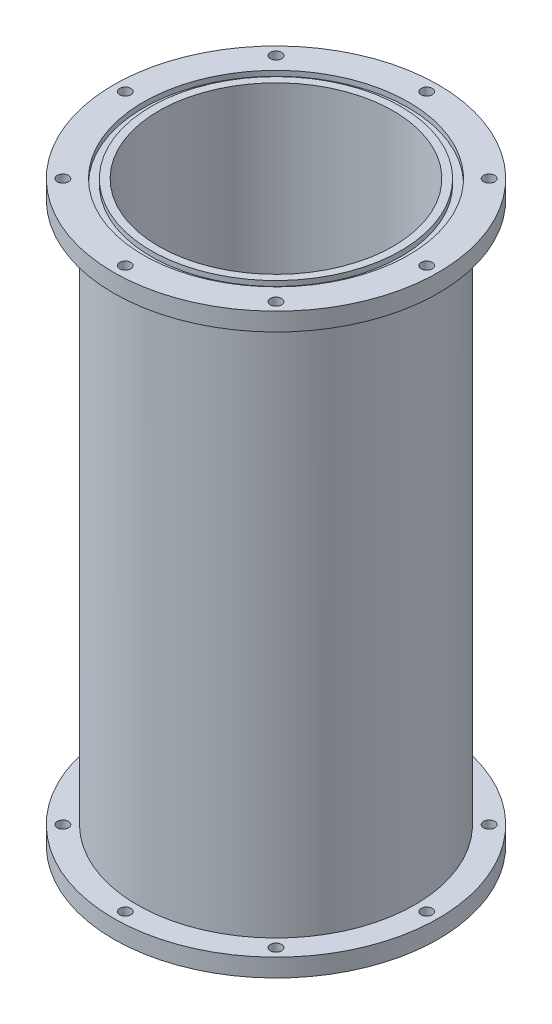
ISO-10303-21;
HEADER;
FILE_DESCRIPTION(('STEP AP214'),'2;1');
FILE_NAME('part.step','',(''),(''),'','','');
FILE_SCHEMA(('AUTOMOTIVE_DESIGN { 1 0 10303 214 1 1 1 1 }'));
ENDSEC;
DATA;
#1=APPLICATION_CONTEXT('core data for automotive mechanical design processes');
#2=APPLICATION_PROTOCOL_DEFINITION('international standard','automotive_design',2000,#1);
#3=PRODUCT_CONTEXT('',#1,'mechanical');
#4=PRODUCT('Part','Part','',(#3));
#5=PRODUCT_RELATED_PRODUCT_CATEGORY('part','',(#4));
#6=PRODUCT_DEFINITION_FORMATION('','',#4);
#7=PRODUCT_DEFINITION_CONTEXT('part definition',#1,'design');
#8=PRODUCT_DEFINITION('design','',#6,#7);
#9=PRODUCT_DEFINITION_SHAPE('','',#8);
#10=(LENGTH_UNIT() NAMED_UNIT(*) SI_UNIT(.MILLI.,.METRE.));
#11=(NAMED_UNIT(*) PLANE_ANGLE_UNIT() SI_UNIT($,.RADIAN.));
#12=(NAMED_UNIT(*) SI_UNIT($,.STERADIAN.) SOLID_ANGLE_UNIT());
#13=UNCERTAINTY_MEASURE_WITH_UNIT(LENGTH_MEASURE(1.E-05),#10,'distance_accuracy_value','');
#14=(GEOMETRIC_REPRESENTATION_CONTEXT(3) GLOBAL_UNCERTAINTY_ASSIGNED_CONTEXT((#13)) GLOBAL_UNIT_ASSIGNED_CONTEXT((#10,
#11,#12)) REPRESENTATION_CONTEXT('',''));
#15=CARTESIAN_POINT('',(0.,0.,0.));
#16=DIRECTION('',(0.,0.,1.));
#17=DIRECTION('',(1.,0.,0.));
#18=AXIS2_PLACEMENT_3D('',#15,#16,#17);
#19=CARTESIAN_POINT('',(0.,0.,0.));
#20=DIRECTION('',(0.,1.,0.));
#21=DIRECTION('',(0.,0.,1.));
#22=AXIS2_PLACEMENT_3D('',#19,#20,#21);
#23=PLANE('',#22);
#24=CARTESIAN_POINT('',(0.,0.,0.));
#25=DIRECTION('',(0.,1.,0.));
#26=DIRECTION('',(0.,0.,1.));
#27=AXIS2_PLACEMENT_3D('',#24,#25,#26);
#28=CIRCLE('',#27,32.5);
#29=CARTESIAN_POINT('',(0.,0.,32.5));
#30=VERTEX_POINT('',#29);
#31=EDGE_CURVE('E57',#30,#30,#28,.T.);
#32=ORIENTED_EDGE('',*,*,#31,.T.);
#33=EDGE_LOOP('',(#32));
#34=FACE_BOUND('',#33,.T.);
#35=CARTESIAN_POINT('',(0.,0.,0.));
#36=DIRECTION('',(0.,-1.,0.));
#37=DIRECTION('',(0.,0.,-1.));
#38=AXIS2_PLACEMENT_3D('',#35,#36,#37);
#39=CIRCLE('',#38,34.6075);
#40=CARTESIAN_POINT('',(0.,0.,-34.6075));
#41=VERTEX_POINT('',#40);
#42=EDGE_CURVE('E229',#41,#41,#39,.T.);
#43=ORIENTED_EDGE('',*,*,#42,.T.);
#44=EDGE_LOOP('',(#43));
#45=FACE_BOUND('',#44,.T.);
#46=ADVANCED_FACE('F44',(#34,#45),#23,.F.);
#47=CARTESIAN_POINT('',(0.,160.,0.));
#48=DIRECTION('',(0.,-1.,0.));
#49=DIRECTION('',(0.,0.,-1.));
#50=AXIS2_PLACEMENT_3D('',#47,#48,#49);
#51=CYLINDRICAL_SURFACE('',#50,38.5);
#52=CARTESIAN_POINT('',(0.,5.,0.));
#53=DIRECTION('',(0.,-1.,0.));
#54=DIRECTION('',(0.,0.,-1.));
#55=AXIS2_PLACEMENT_3D('',#52,#53,#54);
#56=CIRCLE('',#55,38.5);
#57=CARTESIAN_POINT('',(0.,5.,-38.5));
#58=VERTEX_POINT('',#57);
#59=EDGE_CURVE('E52',#58,#58,#56,.T.);
#60=ORIENTED_EDGE('',*,*,#59,.F.);
#61=EDGE_LOOP('',(#60));
#62=FACE_BOUND('',#61,.T.);
#63=CARTESIAN_POINT('',(0.,155.,0.));
#64=DIRECTION('',(0.,1.,0.));
#65=DIRECTION('',(0.,0.,1.));
#66=AXIS2_PLACEMENT_3D('',#63,#64,#65);
#67=CIRCLE('',#66,38.5);
#68=CARTESIAN_POINT('',(0.,155.,38.5));
#69=VERTEX_POINT('',#68);
#70=EDGE_CURVE('E10',#69,#69,#67,.T.);
#71=ORIENTED_EDGE('',*,*,#70,.F.);
#72=EDGE_LOOP('',(#71));
#73=FACE_BOUND('',#72,.T.);
#74=ADVANCED_FACE('F46',(#62,#73),#51,.T.);
#75=CARTESIAN_POINT('',(0.,160.,0.));
#76=DIRECTION('',(0.,-1.,0.));
#77=DIRECTION('',(0.,0.,1.));
#78=AXIS2_PLACEMENT_3D('',#75,#76,#77);
#79=PLANE('',#78);
#80=CARTESIAN_POINT('',(0.,160.,0.));
#81=DIRECTION('',(0.,1.,0.));
#82=DIRECTION('',(0.,0.,1.));
#83=AXIS2_PLACEMENT_3D('',#80,#81,#82);
#84=CIRCLE('',#83,32.5);
#85=CARTESIAN_POINT('',(0.,160.,32.5));
#86=VERTEX_POINT('',#85);
#87=EDGE_CURVE('E86',#86,#86,#84,.T.);
#88=ORIENTED_EDGE('',*,*,#87,.F.);
#89=EDGE_LOOP('',(#88));
#90=FACE_BOUND('',#89,.T.);
#91=CARTESIAN_POINT('',(0.,160.,0.));
#92=DIRECTION('',(0.,-1.,0.));
#93=DIRECTION('',(0.,0.,-1.));
#94=AXIS2_PLACEMENT_3D('',#91,#92,#93);
#95=CIRCLE('',#94,34.6075);
#96=CARTESIAN_POINT('',(0.,160.,-34.6075));
#97=VERTEX_POINT('',#96);
#98=EDGE_CURVE('E141',#97,#97,#95,.T.);
#99=ORIENTED_EDGE('',*,*,#98,.F.);
#100=EDGE_LOOP('',(#99));
#101=FACE_BOUND('',#100,.T.);
#102=ADVANCED_FACE('F260',(#90,#101),#79,.F.);
#103=CARTESIAN_POINT('',(0.,0.,0.));
#104=DIRECTION('',(0.,-1.,0.));
#105=DIRECTION('',(0.,0.,-1.));
#106=AXIS2_PLACEMENT_3D('',#103,#104,#105);
#107=CIRCLE('',#106,36.7411);
#108=CARTESIAN_POINT('',(0.,0.,-36.7411));
#109=VERTEX_POINT('',#108);
#110=EDGE_CURVE('E234',#109,#109,#107,.T.);
#111=ORIENTED_EDGE('',*,*,#110,.F.);
#112=EDGE_LOOP('',(#111));
#113=FACE_BOUND('',#112,.T.);
#114=CARTESIAN_POINT('',(-29.521708114538,0.,-29.5217081145387));
#115=DIRECTION('',(0.,1.,0.));
#116=DIRECTION('',(0.,0.,1.));
#117=AXIS2_PLACEMENT_3D('',#114,#115,#116);
#118=CIRCLE('',#117,1.55);
#119=CARTESIAN_POINT('',(-29.521708114538,0.,-27.9717081145387));
#120=VERTEX_POINT('',#119);
#121=EDGE_CURVE('E81',#120,#120,#118,.T.);
#122=ORIENTED_EDGE('',*,*,#121,.T.);
#123=EDGE_LOOP('',(#122));
#124=FACE_BOUND('',#123,.T.);
#125=CARTESIAN_POINT('',(-41.7499999999995,0.,7.55407097747205E-13));
#126=DIRECTION('',(0.,1.,0.));
#127=DIRECTION('',(0.,0.,1.));
#128=AXIS2_PLACEMENT_3D('',#125,#126,#127);
#129=CIRCLE('',#128,1.55000000000129);
#130=CARTESIAN_POINT('',(-41.7499999999995,0.,1.55000000000205));
#131=VERTEX_POINT('',#130);
#132=EDGE_CURVE('E90',#131,#131,#129,.T.);
#133=ORIENTED_EDGE('',*,*,#132,.T.);
#134=EDGE_LOOP('',(#133));
#135=FACE_BOUND('',#134,.T.);
#136=CARTESIAN_POINT('',(-29.5217081145369,0.,29.5217081145398));
#137=DIRECTION('',(0.,1.,0.));
#138=DIRECTION('',(0.,0.,1.));
#139=AXIS2_PLACEMENT_3D('',#136,#137,#138);
#140=CIRCLE('',#139,1.55000000000227);
#141=CARTESIAN_POINT('',(-29.5217081145369,0.,31.071708114542));
#142=VERTEX_POINT('',#141);
#143=EDGE_CURVE('E98',#142,#142,#140,.T.);
#144=ORIENTED_EDGE('',*,*,#143,.T.);
#145=EDGE_LOOP('',(#144));
#146=FACE_BOUND('',#145,.T.);
#147=CARTESIAN_POINT('',(2.52253439986016E-12,0.,41.7500000000013));
#148=DIRECTION('',(0.,1.,0.));
#149=DIRECTION('',(0.,0.,1.));
#150=AXIS2_PLACEMENT_3D('',#147,#148,#149);
#151=CIRCLE('',#150,1.55000000000233);
#152=CARTESIAN_POINT('',(2.52253439986016E-12,0.,43.3000000000036));
#153=VERTEX_POINT('',#152);
#154=EDGE_CURVE('E106',#153,#153,#151,.T.);
#155=ORIENTED_EDGE('',*,*,#154,.T.);
#156=EDGE_LOOP('',(#155));
#157=FACE_BOUND('',#156,.T.);
#158=CARTESIAN_POINT('',(29.5217081145415,0.,29.5217081145387));
#159=DIRECTION('',(0.,1.,0.));
#160=DIRECTION('',(0.,0.,1.));
#161=AXIS2_PLACEMENT_3D('',#158,#159,#160);
#162=CIRCLE('',#161,1.5500000000014);
#163=CARTESIAN_POINT('',(29.5217081145415,0.,31.0717081145401));
#164=VERTEX_POINT('',#163);
#165=EDGE_CURVE('E114',#164,#164,#162,.T.);
#166=ORIENTED_EDGE('',*,*,#165,.T.);
#167=EDGE_LOOP('',(#166));
#168=FACE_BOUND('',#167,.T.);
#169=CARTESIAN_POINT('',(1.02194600513863E-12,0.,-41.7500000000013));
#170=DIRECTION('',(0.,1.,0.));
#171=DIRECTION('',(0.,0.,1.));
#172=AXIS2_PLACEMENT_3D('',#169,#170,#171);
#173=CIRCLE('',#172,1.54999999999866);
#174=CARTESIAN_POINT('',(1.02194600513863E-12,0.,-40.2000000000026));
#175=VERTEX_POINT('',#174);
#176=EDGE_CURVE('E122',#175,#175,#173,.T.);
#177=ORIENTED_EDGE('',*,*,#176,.T.);
#178=EDGE_LOOP('',(#177));
#179=FACE_BOUND('',#178,.T.);
#180=CARTESIAN_POINT('',(41.750000000003,0.,-7.50294197360764E-13));
#181=DIRECTION('',(0.,1.,0.));
#182=DIRECTION('',(0.,0.,1.));
#183=AXIS2_PLACEMENT_3D('',#180,#181,#182);
#184=CIRCLE('',#183,1.54999999999997);
#185=CARTESIAN_POINT('',(41.750000000003,0.,1.54999999999922));
#186=VERTEX_POINT('',#185);
#187=EDGE_CURVE('E130',#186,#186,#184,.T.);
#188=ORIENTED_EDGE('',*,*,#187,.T.);
#189=EDGE_LOOP('',(#188));
#190=FACE_BOUND('',#189,.T.);
#191=CARTESIAN_POINT('',(29.5217081145405,0.,-29.5217081145398));
#192=DIRECTION('',(0.,1.,0.));
#193=DIRECTION('',(0.,0.,1.));
#194=AXIS2_PLACEMENT_3D('',#191,#192,#193);
#195=CIRCLE('',#194,1.54999999999885);
#196=CARTESIAN_POINT('',(29.5217081145405,0.,-27.9717081145409));
#197=VERTEX_POINT('',#196);
#198=EDGE_CURVE('E69',#197,#197,#195,.T.);
#199=ORIENTED_EDGE('',*,*,#198,.T.);
#200=EDGE_LOOP('',(#199));
#201=FACE_BOUND('',#200,.T.);
#202=CARTESIAN_POINT('',(0.,0.,0.));
#203=DIRECTION('',(0.,-1.,0.));
#204=DIRECTION('',(0.,0.,-1.));
#205=AXIS2_PLACEMENT_3D('',#202,#203,#204);
#206=CIRCLE('',#205,45.);
#207=CARTESIAN_POINT('',(0.,0.,-45.));
#208=VERTEX_POINT('',#207);
#209=EDGE_CURVE('E65',#208,#208,#206,.T.);
#210=ORIENTED_EDGE('',*,*,#209,.T.);
#211=EDGE_LOOP('',(#210));
#212=FACE_BOUND('',#211,.T.);
#213=ADVANCED_FACE('F256',(#113,#124,#135,#146,#157,#168,#179,#190,#201,#212),#23,.F.);
#214=CARTESIAN_POINT('',(0.,5.,0.));
#215=DIRECTION('',(0.,-1.,0.));
#216=DIRECTION('',(0.,0.,-1.));
#217=AXIS2_PLACEMENT_3D('',#214,#215,#216);
#218=CYLINDRICAL_SURFACE('',#217,45.);
#219=CARTESIAN_POINT('',(0.,5.,0.));
#220=DIRECTION('',(0.,-1.,0.));
#221=DIRECTION('',(0.,0.,-1.));
#222=AXIS2_PLACEMENT_3D('',#219,#220,#221);
#223=CIRCLE('',#222,45.);
#224=CARTESIAN_POINT('',(0.,5.,-45.));
#225=VERTEX_POINT('',#224);
#226=EDGE_CURVE('E62',#225,#225,#223,.T.);
#227=ORIENTED_EDGE('',*,*,#226,.T.);
#228=EDGE_LOOP('',(#227));
#229=FACE_BOUND('',#228,.T.);
#230=ORIENTED_EDGE('',*,*,#209,.F.);
#231=EDGE_LOOP('',(#230));
#232=FACE_BOUND('',#231,.T.);
#233=ADVANCED_FACE('F259',(#229,#232),#218,.T.);
#234=CARTESIAN_POINT('',(0.,5.,0.));
#235=DIRECTION('',(0.,-1.,0.));
#236=DIRECTION('',(0.,0.,-1.));
#237=AXIS2_PLACEMENT_3D('',#234,#235,#236);
#238=PLANE('',#237);
#239=CARTESIAN_POINT('',(-29.521708114538,5.,-29.5217081145387));
#240=DIRECTION('',(0.,1.,0.));
#241=DIRECTION('',(0.,0.,1.));
#242=AXIS2_PLACEMENT_3D('',#239,#240,#241);
#243=CIRCLE('',#242,1.55);
#244=CARTESIAN_POINT('',(-29.521708114538,5.,-27.9717081145387));
#245=VERTEX_POINT('',#244);
#246=EDGE_CURVE('E85',#245,#245,#243,.T.);
#247=ORIENTED_EDGE('',*,*,#246,.F.);
#248=EDGE_LOOP('',(#247));
#249=FACE_BOUND('',#248,.T.);
#250=CARTESIAN_POINT('',(-41.7499999999995,5.,7.55407097747205E-13));
#251=DIRECTION('',(0.,1.,0.));
#252=DIRECTION('',(0.,0.,1.));
#253=AXIS2_PLACEMENT_3D('',#250,#251,#252);
#254=CIRCLE('',#253,1.55000000000129);
#255=CARTESIAN_POINT('',(-41.7499999999995,5.,1.55000000000205));
#256=VERTEX_POINT('',#255);
#257=EDGE_CURVE('E94',#256,#256,#254,.T.);
#258=ORIENTED_EDGE('',*,*,#257,.F.);
#259=EDGE_LOOP('',(#258));
#260=FACE_BOUND('',#259,.T.);
#261=CARTESIAN_POINT('',(-29.5217081145369,5.,29.5217081145398));
#262=DIRECTION('',(0.,1.,0.));
#263=DIRECTION('',(0.,0.,1.));
#264=AXIS2_PLACEMENT_3D('',#261,#262,#263);
#265=CIRCLE('',#264,1.55000000000227);
#266=CARTESIAN_POINT('',(-29.5217081145369,5.,31.071708114542));
#267=VERTEX_POINT('',#266);
#268=EDGE_CURVE('E102',#267,#267,#265,.T.);
#269=ORIENTED_EDGE('',*,*,#268,.F.);
#270=EDGE_LOOP('',(#269));
#271=FACE_BOUND('',#270,.T.);
#272=CARTESIAN_POINT('',(2.52253439986016E-12,5.,41.7500000000013));
#273=DIRECTION('',(0.,1.,0.));
#274=DIRECTION('',(0.,0.,1.));
#275=AXIS2_PLACEMENT_3D('',#272,#273,#274);
#276=CIRCLE('',#275,1.55000000000233);
#277=CARTESIAN_POINT('',(2.52253439986016E-12,5.,43.3000000000036));
#278=VERTEX_POINT('',#277);
#279=EDGE_CURVE('E110',#278,#278,#276,.T.);
#280=ORIENTED_EDGE('',*,*,#279,.F.);
#281=EDGE_LOOP('',(#280));
#282=FACE_BOUND('',#281,.T.);
#283=CARTESIAN_POINT('',(29.5217081145415,5.,29.5217081145387));
#284=DIRECTION('',(0.,1.,0.));
#285=DIRECTION('',(0.,0.,1.));
#286=AXIS2_PLACEMENT_3D('',#283,#284,#285);
#287=CIRCLE('',#286,1.5500000000014);
#288=CARTESIAN_POINT('',(29.5217081145415,5.,31.0717081145401));
#289=VERTEX_POINT('',#288);
#290=EDGE_CURVE('E118',#289,#289,#287,.T.);
#291=ORIENTED_EDGE('',*,*,#290,.F.);
#292=EDGE_LOOP('',(#291));
#293=FACE_BOUND('',#292,.T.);
#294=CARTESIAN_POINT('',(1.02194600513863E-12,5.,-41.7500000000013));
#295=DIRECTION('',(0.,1.,0.));
#296=DIRECTION('',(0.,0.,1.));
#297=AXIS2_PLACEMENT_3D('',#294,#295,#296);
#298=CIRCLE('',#297,1.54999999999866);
#299=CARTESIAN_POINT('',(1.02194600513863E-12,5.,-40.2000000000026));
#300=VERTEX_POINT('',#299);
#301=EDGE_CURVE('E126',#300,#300,#298,.T.);
#302=ORIENTED_EDGE('',*,*,#301,.F.);
#303=EDGE_LOOP('',(#302));
#304=FACE_BOUND('',#303,.T.);
#305=CARTESIAN_POINT('',(41.750000000003,5.,-7.50294197360764E-13));
#306=DIRECTION('',(0.,1.,0.));
#307=DIRECTION('',(0.,0.,1.));
#308=AXIS2_PLACEMENT_3D('',#305,#306,#307);
#309=CIRCLE('',#308,1.54999999999997);
#310=CARTESIAN_POINT('',(41.750000000003,5.,1.54999999999922));
#311=VERTEX_POINT('',#310);
#312=EDGE_CURVE('E77',#311,#311,#309,.T.);
#313=ORIENTED_EDGE('',*,*,#312,.F.);
#314=EDGE_LOOP('',(#313));
#315=FACE_BOUND('',#314,.T.);
#316=CARTESIAN_POINT('',(29.5217081145405,5.,-29.5217081145398));
#317=DIRECTION('',(0.,1.,0.));
#318=DIRECTION('',(0.,0.,1.));
#319=AXIS2_PLACEMENT_3D('',#316,#317,#318);
#320=CIRCLE('',#319,1.54999999999885);
#321=CARTESIAN_POINT('',(29.5217081145405,5.,-27.9717081145409));
#322=VERTEX_POINT('',#321);
#323=EDGE_CURVE('E73',#322,#322,#320,.T.);
#324=ORIENTED_EDGE('',*,*,#323,.F.);
#325=EDGE_LOOP('',(#324));
#326=FACE_BOUND('',#325,.T.);
#327=ORIENTED_EDGE('',*,*,#59,.T.);
#328=EDGE_LOOP('',(#327));
#329=FACE_BOUND('',#328,.T.);
#330=ORIENTED_EDGE('',*,*,#226,.F.);
#331=EDGE_LOOP('',(#330));
#332=FACE_BOUND('',#331,.T.);
#333=ADVANCED_FACE('F280',(#249,#260,#271,#282,#293,#304,#315,#326,#329,#332),#238,.F.);
#334=CARTESIAN_POINT('',(29.5217081145405,0.,-29.5217081145398));
#335=DIRECTION('',(0.,1.,0.));
#336=DIRECTION('',(0.,0.,1.));
#337=AXIS2_PLACEMENT_3D('',#334,#335,#336);
#338=CYLINDRICAL_SURFACE('',#337,1.54999999999885);
#339=ORIENTED_EDGE('',*,*,#198,.F.);
#340=EDGE_LOOP('',(#339));
#341=FACE_BOUND('',#340,.T.);
#342=ORIENTED_EDGE('',*,*,#323,.T.);
#343=EDGE_LOOP('',(#342));
#344=FACE_BOUND('',#343,.T.);
#345=ADVANCED_FACE('F286',(#341,#344),#338,.F.);
#346=CARTESIAN_POINT('',(41.750000000003,0.,-7.50294197360764E-13));
#347=DIRECTION('',(0.,1.,0.));
#348=DIRECTION('',(0.,0.,1.));
#349=AXIS2_PLACEMENT_3D('',#346,#347,#348);
#350=CYLINDRICAL_SURFACE('',#349,1.54999999999997);
#351=ORIENTED_EDGE('',*,*,#187,.F.);
#352=EDGE_LOOP('',(#351));
#353=FACE_BOUND('',#352,.T.);
#354=ORIENTED_EDGE('',*,*,#312,.T.);
#355=EDGE_LOOP('',(#354));
#356=FACE_BOUND('',#355,.T.);
#357=ADVANCED_FACE('F334',(#353,#356),#350,.F.);
#358=CARTESIAN_POINT('',(1.02194600513863E-12,0.,-41.7500000000013));
#359=DIRECTION('',(0.,1.,0.));
#360=DIRECTION('',(0.,0.,1.));
#361=AXIS2_PLACEMENT_3D('',#358,#359,#360);
#362=CYLINDRICAL_SURFACE('',#361,1.54999999999866);
#363=ORIENTED_EDGE('',*,*,#176,.F.);
#364=EDGE_LOOP('',(#363));
#365=FACE_BOUND('',#364,.T.);
#366=ORIENTED_EDGE('',*,*,#301,.T.);
#367=EDGE_LOOP('',(#366));
#368=FACE_BOUND('',#367,.T.);
#369=ADVANCED_FACE('F337',(#365,#368),#362,.F.);
#370=CARTESIAN_POINT('',(29.5217081145415,0.,29.5217081145387));
#371=DIRECTION('',(0.,1.,0.));
#372=DIRECTION('',(0.,0.,1.));
#373=AXIS2_PLACEMENT_3D('',#370,#371,#372);
#374=CYLINDRICAL_SURFACE('',#373,1.5500000000014);
#375=ORIENTED_EDGE('',*,*,#165,.F.);
#376=EDGE_LOOP('',(#375));
#377=FACE_BOUND('',#376,.T.);
#378=ORIENTED_EDGE('',*,*,#290,.T.);
#379=EDGE_LOOP('',(#378));
#380=FACE_BOUND('',#379,.T.);
#381=ADVANCED_FACE('F341',(#377,#380),#374,.F.);
#382=CARTESIAN_POINT('',(2.52253439986016E-12,0.,41.7500000000013));
#383=DIRECTION('',(0.,1.,0.));
#384=DIRECTION('',(0.,0.,1.));
#385=AXIS2_PLACEMENT_3D('',#382,#383,#384);
#386=CYLINDRICAL_SURFACE('',#385,1.55000000000233);
#387=ORIENTED_EDGE('',*,*,#154,.F.);
#388=EDGE_LOOP('',(#387));
#389=FACE_BOUND('',#388,.T.);
#390=ORIENTED_EDGE('',*,*,#279,.T.);
#391=EDGE_LOOP('',(#390));
#392=FACE_BOUND('',#391,.T.);
#393=ADVANCED_FACE('F345',(#389,#392),#386,.F.);
#394=CARTESIAN_POINT('',(-29.5217081145369,0.,29.5217081145398));
#395=DIRECTION('',(0.,1.,0.));
#396=DIRECTION('',(0.,0.,1.));
#397=AXIS2_PLACEMENT_3D('',#394,#395,#396);
#398=CYLINDRICAL_SURFACE('',#397,1.55000000000227);
#399=ORIENTED_EDGE('',*,*,#143,.F.);
#400=EDGE_LOOP('',(#399));
#401=FACE_BOUND('',#400,.T.);
#402=ORIENTED_EDGE('',*,*,#268,.T.);
#403=EDGE_LOOP('',(#402));
#404=FACE_BOUND('',#403,.T.);
#405=ADVANCED_FACE('F349',(#401,#404),#398,.F.);
#406=CARTESIAN_POINT('',(-41.7499999999995,0.,7.55407097747205E-13));
#407=DIRECTION('',(0.,1.,0.));
#408=DIRECTION('',(0.,0.,1.));
#409=AXIS2_PLACEMENT_3D('',#406,#407,#408);
#410=CYLINDRICAL_SURFACE('',#409,1.55000000000129);
#411=ORIENTED_EDGE('',*,*,#132,.F.);
#412=EDGE_LOOP('',(#411));
#413=FACE_BOUND('',#412,.T.);
#414=ORIENTED_EDGE('',*,*,#257,.T.);
#415=EDGE_LOOP('',(#414));
#416=FACE_BOUND('',#415,.T.);
#417=ADVANCED_FACE('F353',(#413,#416),#410,.F.);
#418=CARTESIAN_POINT('',(-29.521708114538,0.,-29.5217081145387));
#419=DIRECTION('',(0.,1.,0.));
#420=DIRECTION('',(0.,0.,1.));
#421=AXIS2_PLACEMENT_3D('',#418,#419,#420);
#422=CYLINDRICAL_SURFACE('',#421,1.55);
#423=ORIENTED_EDGE('',*,*,#121,.F.);
#424=EDGE_LOOP('',(#423));
#425=FACE_BOUND('',#424,.T.);
#426=ORIENTED_EDGE('',*,*,#246,.T.);
#427=EDGE_LOOP('',(#426));
#428=FACE_BOUND('',#427,.T.);
#429=ADVANCED_FACE('F310',(#425,#428),#422,.F.);
#430=CARTESIAN_POINT('',(-29.521708114538,160.,-29.5217081145387));
#431=DIRECTION('',(0.,1.,0.));
#432=DIRECTION('',(0.,0.,1.));
#433=AXIS2_PLACEMENT_3D('',#430,#431,#432);
#434=CIRCLE('',#433,1.55);
#435=CARTESIAN_POINT('',(-29.521708114538,160.,-27.9717081145387));
#436=VERTEX_POINT('',#435);
#437=EDGE_CURVE('E177',#436,#436,#434,.T.);
#438=ORIENTED_EDGE('',*,*,#437,.F.);
#439=EDGE_LOOP('',(#438));
#440=FACE_BOUND('',#439,.T.);
#441=CARTESIAN_POINT('',(-41.7499999999995,160.,7.55407097747205E-13));
#442=DIRECTION('',(0.,1.,0.));
#443=DIRECTION('',(0.,0.,1.));
#444=AXIS2_PLACEMENT_3D('',#441,#442,#443);
#445=CIRCLE('',#444,1.55000000000129);
#446=CARTESIAN_POINT('',(-41.7499999999995,160.,1.55000000000205));
#447=VERTEX_POINT('',#446);
#448=EDGE_CURVE('E186',#447,#447,#445,.T.);
#449=ORIENTED_EDGE('',*,*,#448,.F.);
#450=EDGE_LOOP('',(#449));
#451=FACE_BOUND('',#450,.T.);
#452=CARTESIAN_POINT('',(-29.5217081145369,160.,29.5217081145398));
#453=DIRECTION('',(0.,1.,0.));
#454=DIRECTION('',(0.,0.,1.));
#455=AXIS2_PLACEMENT_3D('',#452,#453,#454);
#456=CIRCLE('',#455,1.55000000000227);
#457=CARTESIAN_POINT('',(-29.5217081145369,160.,31.071708114542));
#458=VERTEX_POINT('',#457);
#459=EDGE_CURVE('E194',#458,#458,#456,.T.);
#460=ORIENTED_EDGE('',*,*,#459,.F.);
#461=EDGE_LOOP('',(#460));
#462=FACE_BOUND('',#461,.T.);
#463=CARTESIAN_POINT('',(2.52253439986016E-12,160.,41.7500000000013));
#464=DIRECTION('',(0.,1.,0.));
#465=DIRECTION('',(0.,0.,1.));
#466=AXIS2_PLACEMENT_3D('',#463,#464,#465);
#467=CIRCLE('',#466,1.55000000000233);
#468=CARTESIAN_POINT('',(2.52253439986016E-12,160.,43.3000000000036));
#469=VERTEX_POINT('',#468);
#470=EDGE_CURVE('E202',#469,#469,#467,.T.);
#471=ORIENTED_EDGE('',*,*,#470,.F.);
#472=EDGE_LOOP('',(#471));
#473=FACE_BOUND('',#472,.T.);
#474=CARTESIAN_POINT('',(29.5217081145415,160.,29.5217081145387));
#475=DIRECTION('',(0.,1.,0.));
#476=DIRECTION('',(0.,0.,1.));
#477=AXIS2_PLACEMENT_3D('',#474,#475,#476);
#478=CIRCLE('',#477,1.5500000000014);
#479=CARTESIAN_POINT('',(29.5217081145415,160.,31.0717081145401));
#480=VERTEX_POINT('',#479);
#481=EDGE_CURVE('E210',#480,#480,#478,.T.);
#482=ORIENTED_EDGE('',*,*,#481,.F.);
#483=EDGE_LOOP('',(#482));
#484=FACE_BOUND('',#483,.T.);
#485=CARTESIAN_POINT('',(1.02194600513863E-12,160.,-41.7500000000013));
#486=DIRECTION('',(0.,1.,0.));
#487=DIRECTION('',(0.,0.,1.));
#488=AXIS2_PLACEMENT_3D('',#485,#486,#487);
#489=CIRCLE('',#488,1.54999999999866);
#490=CARTESIAN_POINT('',(1.02194600513863E-12,160.,-40.2000000000026));
#491=VERTEX_POINT('',#490);
#492=EDGE_CURVE('E218',#491,#491,#489,.T.);
#493=ORIENTED_EDGE('',*,*,#492,.F.);
#494=EDGE_LOOP('',(#493));
#495=FACE_BOUND('',#494,.T.);
#496=CARTESIAN_POINT('',(41.750000000003,160.,-7.50294197360764E-13));
#497=DIRECTION('',(0.,1.,0.));
#498=DIRECTION('',(0.,0.,1.));
#499=AXIS2_PLACEMENT_3D('',#496,#497,#498);
#500=CIRCLE('',#499,1.54999999999997);
#501=CARTESIAN_POINT('',(41.750000000003,160.,1.54999999999922));
#502=VERTEX_POINT('',#501);
#503=EDGE_CURVE('E169',#502,#502,#500,.T.);
#504=ORIENTED_EDGE('',*,*,#503,.F.);
#505=EDGE_LOOP('',(#504));
#506=FACE_BOUND('',#505,.T.);
#507=CARTESIAN_POINT('',(29.5217081145405,160.,-29.5217081145398));
#508=DIRECTION('',(0.,1.,0.));
#509=DIRECTION('',(0.,0.,1.));
#510=AXIS2_PLACEMENT_3D('',#507,#508,#509);
#511=CIRCLE('',#510,1.54999999999885);
#512=CARTESIAN_POINT('',(29.5217081145405,160.,-27.9717081145409));
#513=VERTEX_POINT('',#512);
#514=EDGE_CURVE('E161',#513,#513,#511,.T.);
#515=ORIENTED_EDGE('',*,*,#514,.F.);
#516=EDGE_LOOP('',(#515));
#517=FACE_BOUND('',#516,.T.);
#518=CARTESIAN_POINT('',(0.,160.,0.));
#519=DIRECTION('',(0.,-1.,0.));
#520=DIRECTION('',(0.,0.,-1.));
#521=AXIS2_PLACEMENT_3D('',#518,#519,#520);
#522=CIRCLE('',#521,36.7411);
#523=CARTESIAN_POINT('',(0.,160.,-36.7411));
#524=VERTEX_POINT('',#523);
#525=EDGE_CURVE('E146',#524,#524,#522,.T.);
#526=ORIENTED_EDGE('',*,*,#525,.T.);
#527=EDGE_LOOP('',(#526));
#528=FACE_BOUND('',#527,.T.);
#529=CARTESIAN_POINT('',(0.,160.,0.));
#530=DIRECTION('',(0.,-1.,0.));
#531=DIRECTION('',(0.,0.,-1.));
#532=AXIS2_PLACEMENT_3D('',#529,#530,#531);
#533=CIRCLE('',#532,45.);
#534=CARTESIAN_POINT('',(0.,160.,-45.));
#535=VERTEX_POINT('',#534);
#536=EDGE_CURVE('E157',#535,#535,#533,.T.);
#537=ORIENTED_EDGE('',*,*,#536,.F.);
#538=EDGE_LOOP('',(#537));
#539=FACE_BOUND('',#538,.T.);
#540=ADVANCED_FACE('F301',(#440,#451,#462,#473,#484,#495,#506,#517,#528,#539),#79,.F.);
#541=CARTESIAN_POINT('',(0.,160.,0.));
#542=DIRECTION('',(0.,-1.,0.));
#543=DIRECTION('',(0.,0.,-1.));
#544=AXIS2_PLACEMENT_3D('',#541,#542,#543);
#545=CYLINDRICAL_SURFACE('',#544,32.5);
#546=ORIENTED_EDGE('',*,*,#31,.F.);
#547=EDGE_LOOP('',(#546));
#548=FACE_BOUND('',#547,.T.);
#549=ORIENTED_EDGE('',*,*,#87,.T.);
#550=EDGE_LOOP('',(#549));
#551=FACE_BOUND('',#550,.T.);
#552=ADVANCED_FACE('F298',(#548,#551),#545,.F.);
#553=CARTESIAN_POINT('',(0.,158.5776,0.));
#554=DIRECTION('',(0.,1.,0.));
#555=DIRECTION('',(0.,0.,1.));
#556=AXIS2_PLACEMENT_3D('',#553,#554,#555);
#557=CYLINDRICAL_SURFACE('',#556,36.7411);
#558=CARTESIAN_POINT('',(0.,158.5776,0.));
#559=DIRECTION('',(0.,-1.,0.));
#560=DIRECTION('',(0.,0.,-1.));
#561=AXIS2_PLACEMENT_3D('',#558,#559,#560);
#562=CIRCLE('',#561,36.7411);
#563=CARTESIAN_POINT('',(0.,158.5776,-36.7411));
#564=VERTEX_POINT('',#563);
#565=EDGE_CURVE('E145',#564,#564,#562,.T.);
#566=ORIENTED_EDGE('',*,*,#565,.T.);
#567=EDGE_LOOP('',(#566));
#568=FACE_BOUND('',#567,.T.);
#569=ORIENTED_EDGE('',*,*,#525,.F.);
#570=EDGE_LOOP('',(#569));
#571=FACE_BOUND('',#570,.T.);
#572=ADVANCED_FACE('F300',(#568,#571),#557,.F.);
#573=CARTESIAN_POINT('',(0.,158.5776,0.));
#574=DIRECTION('',(0.,1.,0.));
#575=DIRECTION('',(0.,0.,1.));
#576=AXIS2_PLACEMENT_3D('',#573,#574,#575);
#577=CYLINDRICAL_SURFACE('',#576,34.6075);
#578=CARTESIAN_POINT('',(0.,158.5776,0.));
#579=DIRECTION('',(0.,-1.,0.));
#580=DIRECTION('',(0.,0.,-1.));
#581=AXIS2_PLACEMENT_3D('',#578,#579,#580);
#582=CIRCLE('',#581,34.6075);
#583=CARTESIAN_POINT('',(0.,158.5776,-34.6075));
#584=VERTEX_POINT('',#583);
#585=EDGE_CURVE('E140',#584,#584,#582,.T.);
#586=ORIENTED_EDGE('',*,*,#585,.F.);
#587=EDGE_LOOP('',(#586));
#588=FACE_BOUND('',#587,.T.);
#589=ORIENTED_EDGE('',*,*,#98,.T.);
#590=EDGE_LOOP('',(#589));
#591=FACE_BOUND('',#590,.T.);
#592=ADVANCED_FACE('F307',(#588,#591),#577,.T.);
#593=CARTESIAN_POINT('',(0.,158.5776,0.));
#594=DIRECTION('',(0.,1.,0.));
#595=DIRECTION('',(0.,0.,-1.));
#596=AXIS2_PLACEMENT_3D('',#593,#594,#595);
#597=PLANE('',#596);
#598=ORIENTED_EDGE('',*,*,#565,.F.);
#599=EDGE_LOOP('',(#598));
#600=FACE_BOUND('',#599,.T.);
#601=ORIENTED_EDGE('',*,*,#585,.T.);
#602=EDGE_LOOP('',(#601));
#603=FACE_BOUND('',#602,.T.);
#604=ADVANCED_FACE('F322',(#600,#603),#597,.T.);
#605=CARTESIAN_POINT('',(0.,155.,0.));
#606=DIRECTION('',(0.,1.,0.));
#607=DIRECTION('',(0.,0.,1.));
#608=AXIS2_PLACEMENT_3D('',#605,#606,#607);
#609=CYLINDRICAL_SURFACE('',#608,45.);
#610=CARTESIAN_POINT('',(0.,155.,0.));
#611=DIRECTION('',(0.,-1.,0.));
#612=DIRECTION('',(0.,0.,-1.));
#613=AXIS2_PLACEMENT_3D('',#610,#611,#612);
#614=CIRCLE('',#613,45.);
#615=CARTESIAN_POINT('',(0.,155.,-45.));
#616=VERTEX_POINT('',#615);
#617=EDGE_CURVE('E150',#616,#616,#614,.T.);
#618=ORIENTED_EDGE('',*,*,#617,.F.);
#619=EDGE_LOOP('',(#618));
#620=FACE_BOUND('',#619,.T.);
#621=ORIENTED_EDGE('',*,*,#536,.T.);
#622=EDGE_LOOP('',(#621));
#623=FACE_BOUND('',#622,.T.);
#624=ADVANCED_FACE('F328',(#620,#623),#609,.T.);
#625=CARTESIAN_POINT('',(0.,155.,0.));
#626=DIRECTION('',(0.,1.,0.));
#627=DIRECTION('',(0.,0.,-1.));
#628=AXIS2_PLACEMENT_3D('',#625,#626,#627);
#629=PLANE('',#628);
#630=CARTESIAN_POINT('',(-29.521708114538,155.,-29.5217081145387));
#631=DIRECTION('',(0.,1.,0.));
#632=DIRECTION('',(0.,0.,1.));
#633=AXIS2_PLACEMENT_3D('',#630,#631,#632);
#634=CIRCLE('',#633,1.55);
#635=CARTESIAN_POINT('',(-29.521708114538,155.,-27.9717081145387));
#636=VERTEX_POINT('',#635);
#637=EDGE_CURVE('E173',#636,#636,#634,.T.);
#638=ORIENTED_EDGE('',*,*,#637,.T.);
#639=EDGE_LOOP('',(#638));
#640=FACE_BOUND('',#639,.T.);
#641=CARTESIAN_POINT('',(-41.7499999999995,155.,7.55407097747205E-13));
#642=DIRECTION('',(0.,1.,0.));
#643=DIRECTION('',(0.,0.,1.));
#644=AXIS2_PLACEMENT_3D('',#641,#642,#643);
#645=CIRCLE('',#644,1.55000000000129);
#646=CARTESIAN_POINT('',(-41.7499999999995,155.,1.55000000000205));
#647=VERTEX_POINT('',#646);
#648=EDGE_CURVE('E182',#647,#647,#645,.T.);
#649=ORIENTED_EDGE('',*,*,#648,.T.);
#650=EDGE_LOOP('',(#649));
#651=FACE_BOUND('',#650,.T.);
#652=CARTESIAN_POINT('',(-29.5217081145369,155.,29.5217081145398));
#653=DIRECTION('',(0.,1.,0.));
#654=DIRECTION('',(0.,0.,1.));
#655=AXIS2_PLACEMENT_3D('',#652,#653,#654);
#656=CIRCLE('',#655,1.55000000000227);
#657=CARTESIAN_POINT('',(-29.5217081145369,155.,31.071708114542));
#658=VERTEX_POINT('',#657);
#659=EDGE_CURVE('E190',#658,#658,#656,.T.);
#660=ORIENTED_EDGE('',*,*,#659,.T.);
#661=EDGE_LOOP('',(#660));
#662=FACE_BOUND('',#661,.T.);
#663=CARTESIAN_POINT('',(2.52253439986016E-12,155.,41.7500000000013));
#664=DIRECTION('',(0.,1.,0.));
#665=DIRECTION('',(0.,0.,1.));
#666=AXIS2_PLACEMENT_3D('',#663,#664,#665);
#667=CIRCLE('',#666,1.55000000000233);
#668=CARTESIAN_POINT('',(2.52253439986016E-12,155.,43.3000000000036));
#669=VERTEX_POINT('',#668);
#670=EDGE_CURVE('E198',#669,#669,#667,.T.);
#671=ORIENTED_EDGE('',*,*,#670,.T.);
#672=EDGE_LOOP('',(#671));
#673=FACE_BOUND('',#672,.T.);
#674=CARTESIAN_POINT('',(29.5217081145415,155.,29.5217081145387));
#675=DIRECTION('',(0.,1.,0.));
#676=DIRECTION('',(0.,0.,1.));
#677=AXIS2_PLACEMENT_3D('',#674,#675,#676);
#678=CIRCLE('',#677,1.5500000000014);
#679=CARTESIAN_POINT('',(29.5217081145415,155.,31.0717081145401));
#680=VERTEX_POINT('',#679);
#681=EDGE_CURVE('E206',#680,#680,#678,.T.);
#682=ORIENTED_EDGE('',*,*,#681,.T.);
#683=EDGE_LOOP('',(#682));
#684=FACE_BOUND('',#683,.T.);
#685=CARTESIAN_POINT('',(1.02194600513863E-12,155.,-41.7500000000013));
#686=DIRECTION('',(0.,1.,0.));
#687=DIRECTION('',(0.,0.,1.));
#688=AXIS2_PLACEMENT_3D('',#685,#686,#687);
#689=CIRCLE('',#688,1.54999999999866);
#690=CARTESIAN_POINT('',(1.02194600513863E-12,155.,-40.2000000000026));
#691=VERTEX_POINT('',#690);
#692=EDGE_CURVE('E214',#691,#691,#689,.T.);
#693=ORIENTED_EDGE('',*,*,#692,.T.);
#694=EDGE_LOOP('',(#693));
#695=FACE_BOUND('',#694,.T.);
#696=CARTESIAN_POINT('',(41.750000000003,155.,-7.50294197360764E-13));
#697=DIRECTION('',(0.,1.,0.));
#698=DIRECTION('',(0.,0.,1.));
#699=AXIS2_PLACEMENT_3D('',#696,#697,#698);
#700=CIRCLE('',#699,1.54999999999997);
#701=CARTESIAN_POINT('',(41.750000000003,155.,1.54999999999922));
#702=VERTEX_POINT('',#701);
#703=EDGE_CURVE('E222',#702,#702,#700,.T.);
#704=ORIENTED_EDGE('',*,*,#703,.T.);
#705=EDGE_LOOP('',(#704));
#706=FACE_BOUND('',#705,.T.);
#707=CARTESIAN_POINT('',(29.5217081145405,155.,-29.5217081145398));
#708=DIRECTION('',(0.,1.,0.));
#709=DIRECTION('',(0.,0.,1.));
#710=AXIS2_PLACEMENT_3D('',#707,#708,#709);
#711=CIRCLE('',#710,1.54999999999885);
#712=CARTESIAN_POINT('',(29.5217081145405,155.,-27.9717081145409));
#713=VERTEX_POINT('',#712);
#714=EDGE_CURVE('E165',#713,#713,#711,.T.);
#715=ORIENTED_EDGE('',*,*,#714,.T.);
#716=EDGE_LOOP('',(#715));
#717=FACE_BOUND('',#716,.T.);
#718=ORIENTED_EDGE('',*,*,#70,.T.);
#719=EDGE_LOOP('',(#718));
#720=FACE_BOUND('',#719,.T.);
#721=ORIENTED_EDGE('',*,*,#617,.T.);
#722=EDGE_LOOP('',(#721));
#723=FACE_BOUND('',#722,.T.);
#724=ADVANCED_FACE('F439',(#640,#651,#662,#673,#684,#695,#706,#717,#720,#723),#629,.F.);
#725=CARTESIAN_POINT('',(29.5217081145405,160.,-29.5217081145398));
#726=DIRECTION('',(0.,-1.,0.));
#727=DIRECTION('',(0.,0.,-1.));
#728=AXIS2_PLACEMENT_3D('',#725,#726,#727);
#729=CYLINDRICAL_SURFACE('',#728,1.54999999999885);
#730=ORIENTED_EDGE('',*,*,#514,.T.);
#731=EDGE_LOOP('',(#730));
#732=FACE_BOUND('',#731,.T.);
#733=ORIENTED_EDGE('',*,*,#714,.F.);
#734=EDGE_LOOP('',(#733));
#735=FACE_BOUND('',#734,.T.);
#736=ADVANCED_FACE('F448',(#732,#735),#729,.F.);
#737=CARTESIAN_POINT('',(41.750000000003,160.,-7.50294197360764E-13));
#738=DIRECTION('',(0.,-1.,0.));
#739=DIRECTION('',(0.,0.,-1.));
#740=AXIS2_PLACEMENT_3D('',#737,#738,#739);
#741=CYLINDRICAL_SURFACE('',#740,1.54999999999997);
#742=ORIENTED_EDGE('',*,*,#503,.T.);
#743=EDGE_LOOP('',(#742));
#744=FACE_BOUND('',#743,.T.);
#745=ORIENTED_EDGE('',*,*,#703,.F.);
#746=EDGE_LOOP('',(#745));
#747=FACE_BOUND('',#746,.T.);
#748=ADVANCED_FACE('F458',(#744,#747),#741,.F.);
#749=CARTESIAN_POINT('',(1.02194600513863E-12,160.,-41.7500000000013));
#750=DIRECTION('',(0.,-1.,0.));
#751=DIRECTION('',(0.,0.,-1.));
#752=AXIS2_PLACEMENT_3D('',#749,#750,#751);
#753=CYLINDRICAL_SURFACE('',#752,1.54999999999866);
#754=ORIENTED_EDGE('',*,*,#492,.T.);
#755=EDGE_LOOP('',(#754));
#756=FACE_BOUND('',#755,.T.);
#757=ORIENTED_EDGE('',*,*,#692,.F.);
#758=EDGE_LOOP('',(#757));
#759=FACE_BOUND('',#758,.T.);
#760=ADVANCED_FACE('F468',(#756,#759),#753,.F.);
#761=CARTESIAN_POINT('',(29.5217081145415,160.,29.5217081145387));
#762=DIRECTION('',(0.,-1.,0.));
#763=DIRECTION('',(0.,0.,-1.));
#764=AXIS2_PLACEMENT_3D('',#761,#762,#763);
#765=CYLINDRICAL_SURFACE('',#764,1.5500000000014);
#766=ORIENTED_EDGE('',*,*,#481,.T.);
#767=EDGE_LOOP('',(#766));
#768=FACE_BOUND('',#767,.T.);
#769=ORIENTED_EDGE('',*,*,#681,.F.);
#770=EDGE_LOOP('',(#769));
#771=FACE_BOUND('',#770,.T.);
#772=ADVANCED_FACE('F478',(#768,#771),#765,.F.);
#773=CARTESIAN_POINT('',(2.52253439986016E-12,160.,41.7500000000013));
#774=DIRECTION('',(0.,-1.,0.));
#775=DIRECTION('',(0.,0.,-1.));
#776=AXIS2_PLACEMENT_3D('',#773,#774,#775);
#777=CYLINDRICAL_SURFACE('',#776,1.55000000000233);
#778=ORIENTED_EDGE('',*,*,#470,.T.);
#779=EDGE_LOOP('',(#778));
#780=FACE_BOUND('',#779,.T.);
#781=ORIENTED_EDGE('',*,*,#670,.F.);
#782=EDGE_LOOP('',(#781));
#783=FACE_BOUND('',#782,.T.);
#784=ADVANCED_FACE('F488',(#780,#783),#777,.F.);
#785=CARTESIAN_POINT('',(-29.5217081145369,160.,29.5217081145398));
#786=DIRECTION('',(0.,-1.,0.));
#787=DIRECTION('',(0.,0.,-1.));
#788=AXIS2_PLACEMENT_3D('',#785,#786,#787);
#789=CYLINDRICAL_SURFACE('',#788,1.55000000000227);
#790=ORIENTED_EDGE('',*,*,#459,.T.);
#791=EDGE_LOOP('',(#790));
#792=FACE_BOUND('',#791,.T.);
#793=ORIENTED_EDGE('',*,*,#659,.F.);
#794=EDGE_LOOP('',(#793));
#795=FACE_BOUND('',#794,.T.);
#796=ADVANCED_FACE('F498',(#792,#795),#789,.F.);
#797=CARTESIAN_POINT('',(-41.7499999999995,160.,7.55407097747205E-13));
#798=DIRECTION('',(0.,-1.,0.));
#799=DIRECTION('',(0.,0.,-1.));
#800=AXIS2_PLACEMENT_3D('',#797,#798,#799);
#801=CYLINDRICAL_SURFACE('',#800,1.55000000000129);
#802=ORIENTED_EDGE('',*,*,#448,.T.);
#803=EDGE_LOOP('',(#802));
#804=FACE_BOUND('',#803,.T.);
#805=ORIENTED_EDGE('',*,*,#648,.F.);
#806=EDGE_LOOP('',(#805));
#807=FACE_BOUND('',#806,.T.);
#808=ADVANCED_FACE('F508',(#804,#807),#801,.F.);
#809=CARTESIAN_POINT('',(-29.521708114538,160.,-29.5217081145387));
#810=DIRECTION('',(0.,-1.,0.));
#811=DIRECTION('',(0.,0.,-1.));
#812=AXIS2_PLACEMENT_3D('',#809,#810,#811);
#813=CYLINDRICAL_SURFACE('',#812,1.55);
#814=ORIENTED_EDGE('',*,*,#437,.T.);
#815=EDGE_LOOP('',(#814));
#816=FACE_BOUND('',#815,.T.);
#817=ORIENTED_EDGE('',*,*,#637,.F.);
#818=EDGE_LOOP('',(#817));
#819=FACE_BOUND('',#818,.T.);
#820=ADVANCED_FACE('F252',(#816,#819),#813,.F.);
#821=CARTESIAN_POINT('',(0.,1.4224,0.));
#822=DIRECTION('',(0.,-1.,0.));
#823=DIRECTION('',(0.,0.,-1.));
#824=AXIS2_PLACEMENT_3D('',#821,#822,#823);
#825=CYLINDRICAL_SURFACE('',#824,36.7411);
#826=CARTESIAN_POINT('',(0.,1.4224,0.));
#827=DIRECTION('',(0.,-1.,0.));
#828=DIRECTION('',(0.,0.,-1.));
#829=AXIS2_PLACEMENT_3D('',#826,#827,#828);
#830=CIRCLE('',#829,36.7411);
#831=CARTESIAN_POINT('',(0.,1.4224,-36.7411));
#832=VERTEX_POINT('',#831);
#833=EDGE_CURVE('E233',#832,#832,#830,.T.);
#834=ORIENTED_EDGE('',*,*,#833,.F.);
#835=EDGE_LOOP('',(#834));
#836=FACE_BOUND('',#835,.T.);
#837=ORIENTED_EDGE('',*,*,#110,.T.);
#838=EDGE_LOOP('',(#837));
#839=FACE_BOUND('',#838,.T.);
#840=ADVANCED_FACE('F248',(#836,#839),#825,.F.);
#841=CARTESIAN_POINT('',(0.,1.4224,0.));
#842=DIRECTION('',(0.,-1.,0.));
#843=DIRECTION('',(0.,0.,-1.));
#844=AXIS2_PLACEMENT_3D('',#841,#842,#843);
#845=CYLINDRICAL_SURFACE('',#844,34.6075);
#846=CARTESIAN_POINT('',(0.,1.4224,0.));
#847=DIRECTION('',(0.,-1.,0.));
#848=DIRECTION('',(0.,0.,-1.));
#849=AXIS2_PLACEMENT_3D('',#846,#847,#848);
#850=CIRCLE('',#849,34.6075);
#851=CARTESIAN_POINT('',(0.,1.4224,-34.6075));
#852=VERTEX_POINT('',#851);
#853=EDGE_CURVE('E178',#852,#852,#850,.T.);
#854=ORIENTED_EDGE('',*,*,#853,.T.);
#855=EDGE_LOOP('',(#854));
#856=FACE_BOUND('',#855,.T.);
#857=ORIENTED_EDGE('',*,*,#42,.F.);
#858=EDGE_LOOP('',(#857));
#859=FACE_BOUND('',#858,.T.);
#860=ADVANCED_FACE('F251',(#856,#859),#845,.T.);
#861=CARTESIAN_POINT('',(0.,1.4224,0.));
#862=DIRECTION('',(0.,-1.,0.));
#863=DIRECTION('',(0.,0.,-1.));
#864=AXIS2_PLACEMENT_3D('',#861,#862,#863);
#865=PLANE('',#864);
#866=ORIENTED_EDGE('',*,*,#833,.T.);
#867=EDGE_LOOP('',(#866));
#868=FACE_BOUND('',#867,.T.);
#869=ORIENTED_EDGE('',*,*,#853,.F.);
#870=EDGE_LOOP('',(#869));
#871=FACE_BOUND('',#870,.T.);
#872=ADVANCED_FACE('F245',(#868,#871),#865,.T.);
#873=CLOSED_SHELL('',(#46,#74,#102,#213,#233,#333,#345,#357,#369,#381,#393,#405,#417,#429,#540,
#552,#572,#592,#604,#624,#724,#736,#748,#760,#772,#784,#796,#808,#820,#840,#860,#872));
#874=MANIFOLD_SOLID_BREP('B2',#873);
#875=ADVANCED_BREP_SHAPE_REPRESENTATION('',(#18,#874),#14);
#876=SHAPE_DEFINITION_REPRESENTATION(#9,#875);
ENDSEC;
END-ISO-10303-21;
